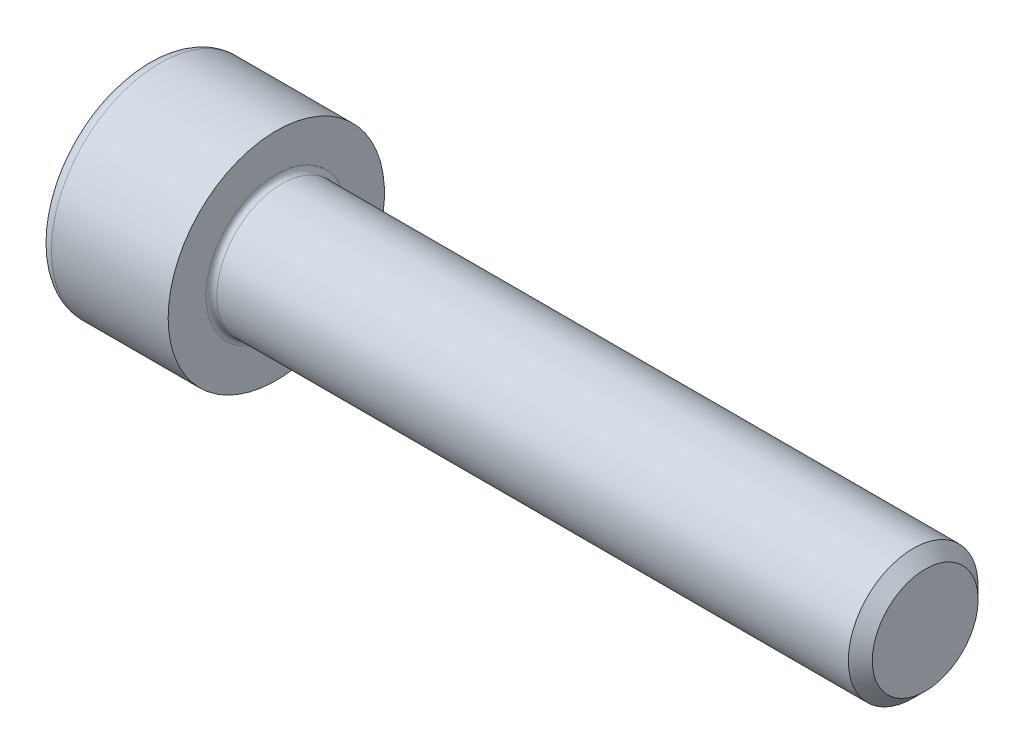
ISO-10303-21;
HEADER;
FILE_DESCRIPTION(('STEP AP214'),'2;1');
FILE_NAME('part.step','',(''),(''),'','','');
FILE_SCHEMA(('AUTOMOTIVE_DESIGN { 1 0 10303 214 1 1 1 1 }'));
ENDSEC;
DATA;
#1=APPLICATION_CONTEXT('core data for automotive mechanical design processes');
#2=APPLICATION_PROTOCOL_DEFINITION('international standard','automotive_design',2000,#1);
#3=PRODUCT_CONTEXT('',#1,'mechanical');
#4=PRODUCT('Part','Part','',(#3));
#5=PRODUCT_RELATED_PRODUCT_CATEGORY('part','',(#4));
#6=PRODUCT_DEFINITION_FORMATION('','',#4);
#7=PRODUCT_DEFINITION_CONTEXT('part definition',#1,'design');
#8=PRODUCT_DEFINITION('design','',#6,#7);
#9=PRODUCT_DEFINITION_SHAPE('','',#8);
#10=(LENGTH_UNIT() NAMED_UNIT(*) SI_UNIT(.MILLI.,.METRE.));
#11=(NAMED_UNIT(*) PLANE_ANGLE_UNIT() SI_UNIT($,.RADIAN.));
#12=(NAMED_UNIT(*) SI_UNIT($,.STERADIAN.) SOLID_ANGLE_UNIT());
#13=UNCERTAINTY_MEASURE_WITH_UNIT(LENGTH_MEASURE(1.E-05),#10,'distance_accuracy_value','');
#14=(GEOMETRIC_REPRESENTATION_CONTEXT(3) GLOBAL_UNCERTAINTY_ASSIGNED_CONTEXT((#13)) GLOBAL_UNIT_ASSIGNED_CONTEXT((#10,
#11,#12)) REPRESENTATION_CONTEXT('',''));
#15=CARTESIAN_POINT('',(0.,0.,0.));
#16=DIRECTION('',(0.,0.,1.));
#17=DIRECTION('',(1.,0.,0.));
#18=AXIS2_PLACEMENT_3D('',#15,#16,#17);
#19=CARTESIAN_POINT('',(0.,0.,0.));
#20=DIRECTION('',(-1.,0.,0.));
#21=DIRECTION('',(0.,0.,1.));
#22=AXIS2_PLACEMENT_3D('',#19,#20,#21);
#23=PLANE('',#22);
#24=DIRECTION('',(0.,-0.499999999999999,0.866025403784439));
#25=VECTOR('',#24,1.);
#26=CARTESIAN_POINT('',(0.,2.89829835133191,0.));
#27=LINE('',#26,#25);
#28=CARTESIAN_POINT('',(0.,2.89829835133191,0.));
#29=VERTEX_POINT('',#28);
#30=CARTESIAN_POINT('',(0.,1.44914917566596,2.50999999999999));
#31=VERTEX_POINT('',#30);
#32=EDGE_CURVE('E266',#29,#31,#27,.T.);
#33=ORIENTED_EDGE('',*,*,#32,.T.);
#34=DIRECTION('',(0.,1.,0.));
#35=VECTOR('',#34,1.);
#36=CARTESIAN_POINT('',(0.,-1.44914917566596,2.51));
#37=LINE('',#36,#35);
#38=CARTESIAN_POINT('',(0.,-1.44914917566596,2.51));
#39=VERTEX_POINT('',#38);
#40=EDGE_CURVE('E127',#39,#31,#37,.T.);
#41=ORIENTED_EDGE('',*,*,#40,.F.);
#42=DIRECTION('',(0.,-0.500000000000001,-0.866025403784438));
#43=VECTOR('',#42,1.);
#44=CARTESIAN_POINT('',(0.,-1.44914917566596,2.51));
#45=LINE('',#44,#43);
#46=CARTESIAN_POINT('',(0.,-2.89829835133192,0.));
#47=VERTEX_POINT('',#46);
#48=EDGE_CURVE('E269',#39,#47,#45,.T.);
#49=ORIENTED_EDGE('',*,*,#48,.T.);
#50=DIRECTION('',(0.,0.499999999999999,-0.866025403784439));
#51=VECTOR('',#50,1.);
#52=CARTESIAN_POINT('',(0.,-2.89829835133192,0.));
#53=LINE('',#52,#51);
#54=CARTESIAN_POINT('',(0.,-1.44914917566597,-2.51));
#55=VERTEX_POINT('',#54);
#56=EDGE_CURVE('E272',#47,#55,#53,.T.);
#57=ORIENTED_EDGE('',*,*,#56,.T.);
#58=DIRECTION('',(0.,-1.,0.));
#59=VECTOR('',#58,1.);
#60=CARTESIAN_POINT('',(0.,1.44914917566595,-2.51));
#61=LINE('',#60,#59);
#62=CARTESIAN_POINT('',(0.,1.44914917566595,-2.51));
#63=VERTEX_POINT('',#62);
#64=EDGE_CURVE('E275',#63,#55,#61,.T.);
#65=ORIENTED_EDGE('',*,*,#64,.F.);
#66=DIRECTION('',(0.,-0.500000000000001,-0.866025403784438));
#67=VECTOR('',#66,1.);
#68=CARTESIAN_POINT('',(0.,2.89829835133191,0.));
#69=LINE('',#68,#67);
#70=EDGE_CURVE('E122',#29,#63,#69,.T.);
#71=ORIENTED_EDGE('',*,*,#70,.F.);
#72=EDGE_LOOP('',(#33,#41,#49,#57,#65,#71));
#73=FACE_BOUND('',#72,.T.);
#74=CARTESIAN_POINT('',(0.,0.,0.));
#75=DIRECTION('',(-1.,0.,0.));
#76=DIRECTION('',(0.,0.,1.));
#77=AXIS2_PLACEMENT_3D('',#74,#75,#76);
#78=CIRCLE('',#77,4.4);
#79=CARTESIAN_POINT('',(0.,0.,4.4));
#80=VERTEX_POINT('',#79);
#81=EDGE_CURVE('E43',#80,#80,#78,.T.);
#82=ORIENTED_EDGE('',*,*,#81,.T.);
#83=EDGE_LOOP('',(#82));
#84=FACE_BOUND('',#83,.T.);
#85=ADVANCED_FACE('F35',(#73,#84),#23,.T.);
#86=CARTESIAN_POINT('',(-31.75,0.,0.));
#87=DIRECTION('',(-1.,0.,0.));
#88=DIRECTION('',(0.,0.,1.));
#89=AXIS2_PLACEMENT_3D('',#86,#87,#88);
#90=CYLINDRICAL_SURFACE('',#89,5.);
#91=CARTESIAN_POINT('',(0.600000000000003,0.,0.));
#92=DIRECTION('',(-1.,0.,0.));
#93=DIRECTION('',(0.,0.,1.));
#94=AXIS2_PLACEMENT_3D('',#91,#92,#93);
#95=CIRCLE('',#94,5.);
#96=CARTESIAN_POINT('',(0.600000000000003,0.,5.));
#97=VERTEX_POINT('',#96);
#98=EDGE_CURVE('E11',#97,#97,#95,.F.);
#99=ORIENTED_EDGE('',*,*,#98,.T.);
#100=EDGE_LOOP('',(#99));
#101=FACE_BOUND('',#100,.T.);
#102=CARTESIAN_POINT('',(6.,0.,0.));
#103=DIRECTION('',(-1.,0.,0.));
#104=DIRECTION('',(0.,0.,1.));
#105=AXIS2_PLACEMENT_3D('',#102,#103,#104);
#106=CIRCLE('',#105,5.);
#107=CARTESIAN_POINT('',(6.,0.,5.));
#108=VERTEX_POINT('',#107);
#109=EDGE_CURVE('E145',#108,#108,#106,.T.);
#110=ORIENTED_EDGE('',*,*,#109,.T.);
#111=EDGE_LOOP('',(#110));
#112=FACE_BOUND('',#111,.T.);
#113=ADVANCED_FACE('F169',(#101,#112),#90,.T.);
#114=CARTESIAN_POINT('',(6.,5.,0.));
#115=DIRECTION('',(1.,0.,0.));
#116=DIRECTION('',(0.,0.,-1.));
#117=AXIS2_PLACEMENT_3D('',#114,#115,#116);
#118=PLANE('',#117);
#119=CARTESIAN_POINT('',(6.,0.,0.));
#120=DIRECTION('',(1.,0.,0.));
#121=DIRECTION('',(0.,0.,-1.));
#122=AXIS2_PLACEMENT_3D('',#119,#120,#121);
#123=CIRCLE('',#122,3.24999999999999);
#124=CARTESIAN_POINT('',(6.,0.,-3.24999999999999));
#125=VERTEX_POINT('',#124);
#126=EDGE_CURVE('E148',#125,#125,#123,.F.);
#127=ORIENTED_EDGE('',*,*,#126,.T.);
#128=EDGE_LOOP('',(#127));
#129=FACE_BOUND('',#128,.T.);
#130=ORIENTED_EDGE('',*,*,#109,.F.);
#131=EDGE_LOOP('',(#130));
#132=FACE_BOUND('',#131,.T.);
#133=ADVANCED_FACE('F175',(#129,#132),#118,.T.);
#134=CARTESIAN_POINT('',(-31.75,0.,0.));
#135=DIRECTION('',(-1.,0.,0.));
#136=DIRECTION('',(0.,0.,1.));
#137=AXIS2_PLACEMENT_3D('',#134,#135,#136);
#138=CYLINDRICAL_SURFACE('',#137,2.99999999999999);
#139=CARTESIAN_POINT('',(6.25,0.,0.));
#140=DIRECTION('',(1.,0.,0.));
#141=DIRECTION('',(0.,0.,-1.));
#142=AXIS2_PLACEMENT_3D('',#139,#140,#141);
#143=CIRCLE('',#142,2.99999999999999);
#144=CARTESIAN_POINT('',(6.25,0.,-2.99999999999999));
#145=VERTEX_POINT('',#144);
#146=EDGE_CURVE('E151',#145,#145,#143,.T.);
#147=ORIENTED_EDGE('',*,*,#146,.T.);
#148=EDGE_LOOP('',(#147));
#149=FACE_BOUND('',#148,.T.);
#150=CARTESIAN_POINT('',(35.4455,0.,0.));
#151=DIRECTION('',(-1.,0.,0.));
#152=DIRECTION('',(0.,0.,1.));
#153=AXIS2_PLACEMENT_3D('',#150,#151,#152);
#154=CIRCLE('',#153,2.99999999999999);
#155=CARTESIAN_POINT('',(35.4455,0.,2.99999999999999));
#156=VERTEX_POINT('',#155);
#157=EDGE_CURVE('E142',#156,#156,#154,.T.);
#158=ORIENTED_EDGE('',*,*,#157,.T.);
#159=EDGE_LOOP('',(#158));
#160=FACE_BOUND('',#159,.T.);
#161=ADVANCED_FACE('F181',(#149,#160),#138,.T.);
#162=CARTESIAN_POINT('',(36.,0.,0.));
#163=DIRECTION('',(-1.,0.,0.));
#164=DIRECTION('',(0.,0.,1.));
#165=AXIS2_PLACEMENT_3D('',#162,#163,#164);
#166=CONICAL_SURFACE('',#165,2.4455,0.785398163397436);
#167=ORIENTED_EDGE('',*,*,#157,.F.);
#168=EDGE_LOOP('',(#167));
#169=FACE_BOUND('',#168,.T.);
#170=CARTESIAN_POINT('',(36.,0.,0.));
#171=DIRECTION('',(-1.,0.,0.));
#172=DIRECTION('',(0.,0.,1.));
#173=AXIS2_PLACEMENT_3D('',#170,#171,#172);
#174=CIRCLE('',#173,2.4455);
#175=CARTESIAN_POINT('',(36.,0.,2.4455));
#176=VERTEX_POINT('',#175);
#177=EDGE_CURVE('E138',#176,#176,#174,.T.);
#178=ORIENTED_EDGE('',*,*,#177,.T.);
#179=EDGE_LOOP('',(#178));
#180=FACE_BOUND('',#179,.T.);
#181=ADVANCED_FACE('F185',(#169,#180),#166,.T.);
#182=CARTESIAN_POINT('',(36.,2.4455,0.));
#183=DIRECTION('',(1.,0.,0.));
#184=DIRECTION('',(0.,0.,-1.));
#185=AXIS2_PLACEMENT_3D('',#182,#183,#184);
#186=PLANE('',#185);
#187=ORIENTED_EDGE('',*,*,#177,.F.);
#188=EDGE_LOOP('',(#187));
#189=FACE_BOUND('',#188,.T.);
#190=ADVANCED_FACE('F165',(#189),#186,.T.);
#191=CARTESIAN_POINT('',(6.25,0.,0.));
#192=DIRECTION('',(1.,0.,0.));
#193=DIRECTION('',(0.,0.,-1.));
#194=AXIS2_PLACEMENT_3D('',#191,#192,#193);
#195=TOROIDAL_SURFACE('',#194,3.24999999999999,0.25);
#196=ORIENTED_EDGE('',*,*,#146,.F.);
#197=EDGE_LOOP('',(#196));
#198=FACE_BOUND('',#197,.T.);
#199=ORIENTED_EDGE('',*,*,#126,.F.);
#200=EDGE_LOOP('',(#199));
#201=FACE_BOUND('',#200,.T.);
#202=ADVANCED_FACE('F158',(#198,#201),#195,.F.);
#203=CARTESIAN_POINT('',(0.600000000000003,0.,0.));
#204=DIRECTION('',(-1.,0.,0.));
#205=DIRECTION('',(0.,0.,1.));
#206=AXIS2_PLACEMENT_3D('',#203,#204,#205);
#207=TOROIDAL_SURFACE('',#206,4.4,0.6);
#208=ORIENTED_EDGE('',*,*,#98,.F.);
#209=EDGE_LOOP('',(#208));
#210=FACE_BOUND('',#209,.T.);
#211=ORIENTED_EDGE('',*,*,#81,.F.);
#212=EDGE_LOOP('',(#211));
#213=FACE_BOUND('',#212,.T.);
#214=ADVANCED_FACE('F37',(#210,#213),#207,.T.);
#215=CARTESIAN_POINT('',(3.,2.89829835133191,0.));
#216=DIRECTION('',(0.,-0.866025403784439,-0.499999999999999));
#217=DIRECTION('',(0.,0.499999999999999,-0.866025403784439));
#218=AXIS2_PLACEMENT_3D('',#215,#216,#217);
#219=PLANE('',#218);
#220=ORIENTED_EDGE('',*,*,#32,.F.);
#221=DIRECTION('',(-1.,0.,0.));
#222=VECTOR('',#221,1.);
#223=CARTESIAN_POINT('',(3.,2.89829835133191,0.));
#224=LINE('',#223,#222);
#225=CARTESIAN_POINT('',(3.,2.89829835133191,0.));
#226=VERTEX_POINT('',#225);
#227=EDGE_CURVE('E265',#226,#29,#224,.T.);
#228=ORIENTED_EDGE('',*,*,#227,.F.);
#229=DIRECTION('',(0.,-0.499999999999999,0.866025403784439));
#230=VECTOR('',#229,1.);
#231=CARTESIAN_POINT('',(3.,2.89829835133191,0.));
#232=LINE('',#231,#230);
#233=CARTESIAN_POINT('',(3.,2.17372376349894,1.255));
#234=VERTEX_POINT('',#233);
#235=EDGE_CURVE('E50',#226,#234,#232,.T.);
#236=ORIENTED_EDGE('',*,*,#235,.T.);
#237=CARTESIAN_POINT('',(3.,1.44914917566596,2.50999999999999));
#238=VERTEX_POINT('',#237);
#239=EDGE_CURVE('E108',#234,#238,#232,.T.);
#240=ORIENTED_EDGE('',*,*,#239,.T.);
#241=DIRECTION('',(-1.,0.,0.));
#242=VECTOR('',#241,1.);
#243=CARTESIAN_POINT('',(3.,1.44914917566596,2.50999999999999));
#244=LINE('',#243,#242);
#245=EDGE_CURVE('E120',#238,#31,#244,.T.);
#246=ORIENTED_EDGE('',*,*,#245,.T.);
#247=EDGE_LOOP('',(#220,#228,#236,#240,#246));
#248=FACE_BOUND('',#247,.T.);
#249=ADVANCED_FACE('F119',(#248),#219,.T.);
#250=CARTESIAN_POINT('',(3.,-1.44914917566596,2.51));
#251=DIRECTION('',(0.,0.,1.));
#252=DIRECTION('',(0.,-1.,0.));
#253=AXIS2_PLACEMENT_3D('',#250,#251,#252);
#254=PLANE('',#253);
#255=ORIENTED_EDGE('',*,*,#40,.T.);
#256=ORIENTED_EDGE('',*,*,#245,.F.);
#257=DIRECTION('',(0.,1.,0.));
#258=VECTOR('',#257,1.);
#259=CARTESIAN_POINT('',(3.,-1.44914917566596,2.51));
#260=LINE('',#259,#258);
#261=CARTESIAN_POINT('',(3.,0.,2.51));
#262=VERTEX_POINT('',#261);
#263=EDGE_CURVE('E106',#262,#238,#260,.T.);
#264=ORIENTED_EDGE('',*,*,#263,.F.);
#265=CARTESIAN_POINT('',(3.,-1.44914917566596,2.51));
#266=VERTEX_POINT('',#265);
#267=EDGE_CURVE('E116',#266,#262,#260,.T.);
#268=ORIENTED_EDGE('',*,*,#267,.F.);
#269=DIRECTION('',(-1.,0.,0.));
#270=VECTOR('',#269,1.);
#271=CARTESIAN_POINT('',(3.,-1.44914917566596,2.51));
#272=LINE('',#271,#270);
#273=EDGE_CURVE('E129',#266,#39,#272,.T.);
#274=ORIENTED_EDGE('',*,*,#273,.T.);
#275=EDGE_LOOP('',(#255,#256,#264,#268,#274));
#276=FACE_BOUND('',#275,.T.);
#277=ADVANCED_FACE('F124',(#276),#254,.F.);
#278=CARTESIAN_POINT('',(3.,-1.44914917566596,2.51));
#279=DIRECTION('',(0.,0.866025403784438,-0.500000000000001));
#280=DIRECTION('',(0.,0.500000000000001,0.866025403784438));
#281=AXIS2_PLACEMENT_3D('',#278,#279,#280);
#282=PLANE('',#281);
#283=ORIENTED_EDGE('',*,*,#48,.F.);
#284=ORIENTED_EDGE('',*,*,#273,.F.);
#285=DIRECTION('',(0.,-0.500000000000001,-0.866025403784438));
#286=VECTOR('',#285,1.);
#287=CARTESIAN_POINT('',(3.,-1.44914917566596,2.51));
#288=LINE('',#287,#286);
#289=CARTESIAN_POINT('',(3.,-2.17372376349894,1.255));
#290=VERTEX_POINT('',#289);
#291=EDGE_CURVE('E246',#266,#290,#288,.T.);
#292=ORIENTED_EDGE('',*,*,#291,.T.);
#293=CARTESIAN_POINT('',(3.,-2.89829835133192,0.));
#294=VERTEX_POINT('',#293);
#295=EDGE_CURVE('E248',#290,#294,#288,.T.);
#296=ORIENTED_EDGE('',*,*,#295,.T.);
#297=DIRECTION('',(-1.,0.,0.));
#298=VECTOR('',#297,1.);
#299=CARTESIAN_POINT('',(3.,-2.89829835133192,0.));
#300=LINE('',#299,#298);
#301=EDGE_CURVE('E134',#294,#47,#300,.T.);
#302=ORIENTED_EDGE('',*,*,#301,.T.);
#303=EDGE_LOOP('',(#283,#284,#292,#296,#302));
#304=FACE_BOUND('',#303,.T.);
#305=ADVANCED_FACE('F198',(#304),#282,.T.);
#306=CARTESIAN_POINT('',(3.,-2.89829835133192,0.));
#307=DIRECTION('',(0.,0.866025403784439,0.499999999999999));
#308=DIRECTION('',(0.,-0.499999999999999,0.866025403784439));
#309=AXIS2_PLACEMENT_3D('',#306,#307,#308);
#310=PLANE('',#309);
#311=ORIENTED_EDGE('',*,*,#56,.F.);
#312=ORIENTED_EDGE('',*,*,#301,.F.);
#313=DIRECTION('',(0.,0.499999999999999,-0.866025403784439));
#314=VECTOR('',#313,1.);
#315=CARTESIAN_POINT('',(3.,-2.89829835133192,0.));
#316=LINE('',#315,#314);
#317=CARTESIAN_POINT('',(3.,-2.17372376349895,-1.255));
#318=VERTEX_POINT('',#317);
#319=EDGE_CURVE('E251',#294,#318,#316,.T.);
#320=ORIENTED_EDGE('',*,*,#319,.T.);
#321=CARTESIAN_POINT('',(3.,-1.44914917566597,-2.51));
#322=VERTEX_POINT('',#321);
#323=EDGE_CURVE('E255',#318,#322,#316,.T.);
#324=ORIENTED_EDGE('',*,*,#323,.T.);
#325=DIRECTION('',(-1.,0.,0.));
#326=VECTOR('',#325,1.);
#327=CARTESIAN_POINT('',(3.,-1.44914917566597,-2.51));
#328=LINE('',#327,#326);
#329=EDGE_CURVE('E284',#322,#55,#328,.T.);
#330=ORIENTED_EDGE('',*,*,#329,.T.);
#331=EDGE_LOOP('',(#311,#312,#320,#324,#330));
#332=FACE_BOUND('',#331,.T.);
#333=ADVANCED_FACE('F201',(#332),#310,.T.);
#334=CARTESIAN_POINT('',(3.,1.44914917566595,-2.51));
#335=DIRECTION('',(0.,0.,-1.));
#336=DIRECTION('',(0.,1.,0.));
#337=AXIS2_PLACEMENT_3D('',#334,#335,#336);
#338=PLANE('',#337);
#339=ORIENTED_EDGE('',*,*,#64,.T.);
#340=ORIENTED_EDGE('',*,*,#329,.F.);
#341=DIRECTION('',(0.,-1.,0.));
#342=VECTOR('',#341,1.);
#343=CARTESIAN_POINT('',(3.,1.44914917566595,-2.51));
#344=LINE('',#343,#342);
#345=CARTESIAN_POINT('',(3.,0.,-2.51));
#346=VERTEX_POINT('',#345);
#347=EDGE_CURVE('E259',#346,#322,#344,.T.);
#348=ORIENTED_EDGE('',*,*,#347,.F.);
#349=CARTESIAN_POINT('',(3.,1.44914917566595,-2.51));
#350=VERTEX_POINT('',#349);
#351=EDGE_CURVE('E260',#350,#346,#344,.T.);
#352=ORIENTED_EDGE('',*,*,#351,.F.);
#353=DIRECTION('',(-1.,0.,0.));
#354=VECTOR('',#353,1.);
#355=CARTESIAN_POINT('',(3.,1.44914917566595,-2.51));
#356=LINE('',#355,#354);
#357=EDGE_CURVE('E281',#350,#63,#356,.T.);
#358=ORIENTED_EDGE('',*,*,#357,.T.);
#359=EDGE_LOOP('',(#339,#340,#348,#352,#358));
#360=FACE_BOUND('',#359,.T.);
#361=ADVANCED_FACE('F205',(#360),#338,.F.);
#362=CARTESIAN_POINT('',(3.,2.89829835133191,0.));
#363=DIRECTION('',(0.,0.866025403784438,-0.500000000000001));
#364=DIRECTION('',(0.,0.500000000000001,0.866025403784438));
#365=AXIS2_PLACEMENT_3D('',#362,#363,#364);
#366=PLANE('',#365);
#367=ORIENTED_EDGE('',*,*,#70,.T.);
#368=ORIENTED_EDGE('',*,*,#357,.F.);
#369=DIRECTION('',(0.,-0.500000000000001,-0.866025403784438));
#370=VECTOR('',#369,1.);
#371=CARTESIAN_POINT('',(3.,2.89829835133191,0.));
#372=LINE('',#371,#370);
#373=CARTESIAN_POINT('',(3.,2.17372376349894,-1.255));
#374=VERTEX_POINT('',#373);
#375=EDGE_CURVE('E263',#374,#350,#372,.T.);
#376=ORIENTED_EDGE('',*,*,#375,.F.);
#377=EDGE_CURVE('E237',#226,#374,#372,.T.);
#378=ORIENTED_EDGE('',*,*,#377,.F.);
#379=ORIENTED_EDGE('',*,*,#227,.T.);
#380=EDGE_LOOP('',(#367,#368,#376,#378,#379));
#381=FACE_BOUND('',#380,.T.);
#382=ADVANCED_FACE('F209',(#381),#366,.F.);
#383=CARTESIAN_POINT('',(3.,1.44914917566596,2.50999999999999));
#384=DIRECTION('',(-1.,0.,0.));
#385=DIRECTION('',(0.,0.,1.));
#386=AXIS2_PLACEMENT_3D('',#383,#384,#385);
#387=PLANE('',#386);
#388=CARTESIAN_POINT('',(3.,0.,0.));
#389=DIRECTION('',(-1.,0.,0.));
#390=DIRECTION('',(0.,0.,1.));
#391=AXIS2_PLACEMENT_3D('',#388,#389,#390);
#392=CIRCLE('',#391,2.51);
#393=EDGE_CURVE('E128',#290,#262,#392,.T.);
#394=ORIENTED_EDGE('',*,*,#393,.F.);
#395=ORIENTED_EDGE('',*,*,#291,.F.);
#396=ORIENTED_EDGE('',*,*,#267,.T.);
#397=EDGE_LOOP('',(#394,#395,#396));
#398=FACE_BOUND('',#397,.T.);
#399=ADVANCED_FACE('F213',(#398),#387,.T.);
#400=EDGE_CURVE('E132',#318,#290,#392,.T.);
#401=ORIENTED_EDGE('',*,*,#400,.F.);
#402=ORIENTED_EDGE('',*,*,#319,.F.);
#403=ORIENTED_EDGE('',*,*,#295,.F.);
#404=EDGE_LOOP('',(#401,#402,#403));
#405=FACE_BOUND('',#404,.T.);
#406=ADVANCED_FACE('F216',(#405),#387,.T.);
#407=EDGE_CURVE('E290',#346,#318,#392,.T.);
#408=ORIENTED_EDGE('',*,*,#407,.F.);
#409=ORIENTED_EDGE('',*,*,#347,.T.);
#410=ORIENTED_EDGE('',*,*,#323,.F.);
#411=EDGE_LOOP('',(#408,#409,#410));
#412=FACE_BOUND('',#411,.T.);
#413=ADVANCED_FACE('F221',(#412),#387,.T.);
#414=EDGE_CURVE('E240',#374,#346,#392,.T.);
#415=ORIENTED_EDGE('',*,*,#414,.F.);
#416=ORIENTED_EDGE('',*,*,#375,.T.);
#417=ORIENTED_EDGE('',*,*,#351,.T.);
#418=EDGE_LOOP('',(#415,#416,#417));
#419=FACE_BOUND('',#418,.T.);
#420=ADVANCED_FACE('F228',(#419),#387,.T.);
#421=EDGE_CURVE('E139',#234,#374,#392,.T.);
#422=ORIENTED_EDGE('',*,*,#421,.F.);
#423=ORIENTED_EDGE('',*,*,#235,.F.);
#424=ORIENTED_EDGE('',*,*,#377,.T.);
#425=EDGE_LOOP('',(#422,#423,#424));
#426=FACE_BOUND('',#425,.T.);
#427=ADVANCED_FACE('F224',(#426),#387,.T.);
#428=EDGE_CURVE('E111',#262,#234,#392,.T.);
#429=ORIENTED_EDGE('',*,*,#428,.F.);
#430=ORIENTED_EDGE('',*,*,#263,.T.);
#431=ORIENTED_EDGE('',*,*,#239,.F.);
#432=EDGE_LOOP('',(#429,#430,#431));
#433=FACE_BOUND('',#432,.T.);
#434=ADVANCED_FACE('F107',(#433),#387,.T.);
#435=CARTESIAN_POINT('',(3.,0.,0.));
#436=DIRECTION('',(-1.,0.,0.));
#437=DIRECTION('',(0.,0.,1.));
#438=AXIS2_PLACEMENT_3D('',#435,#436,#437);
#439=CONICAL_SURFACE('',#438,2.51,1.04719755119659);
#440=CARTESIAN_POINT('',(4.44914917566598,0.,0.));
#441=VERTEX_POINT('',#440);
#442=VERTEX_LOOP('',#441);
#443=FACE_BOUND('',#442,.T.);
#444=ORIENTED_EDGE('',*,*,#428,.T.);
#445=ORIENTED_EDGE('',*,*,#421,.T.);
#446=ORIENTED_EDGE('',*,*,#414,.T.);
#447=ORIENTED_EDGE('',*,*,#407,.T.);
#448=ORIENTED_EDGE('',*,*,#400,.T.);
#449=ORIENTED_EDGE('',*,*,#393,.T.);
#450=EDGE_LOOP('',(#444,#445,#446,#447,#448,#449));
#451=FACE_BOUND('',#450,.T.);
#452=ADVANCED_FACE('F193',(#443,#451),#439,.F.);
#453=CLOSED_SHELL('',(#85,#113,#133,#161,#181,#190,#202,#214,#249,#277,#305,#333,#361,#382,#399,
#406,#413,#420,#427,#434,#452));
#454=MANIFOLD_SOLID_BREP('B2',#453);
#455=ADVANCED_BREP_SHAPE_REPRESENTATION('',(#18,#454),#14);
#456=SHAPE_DEFINITION_REPRESENTATION(#9,#455);
ENDSEC;
END-ISO-10303-21;
